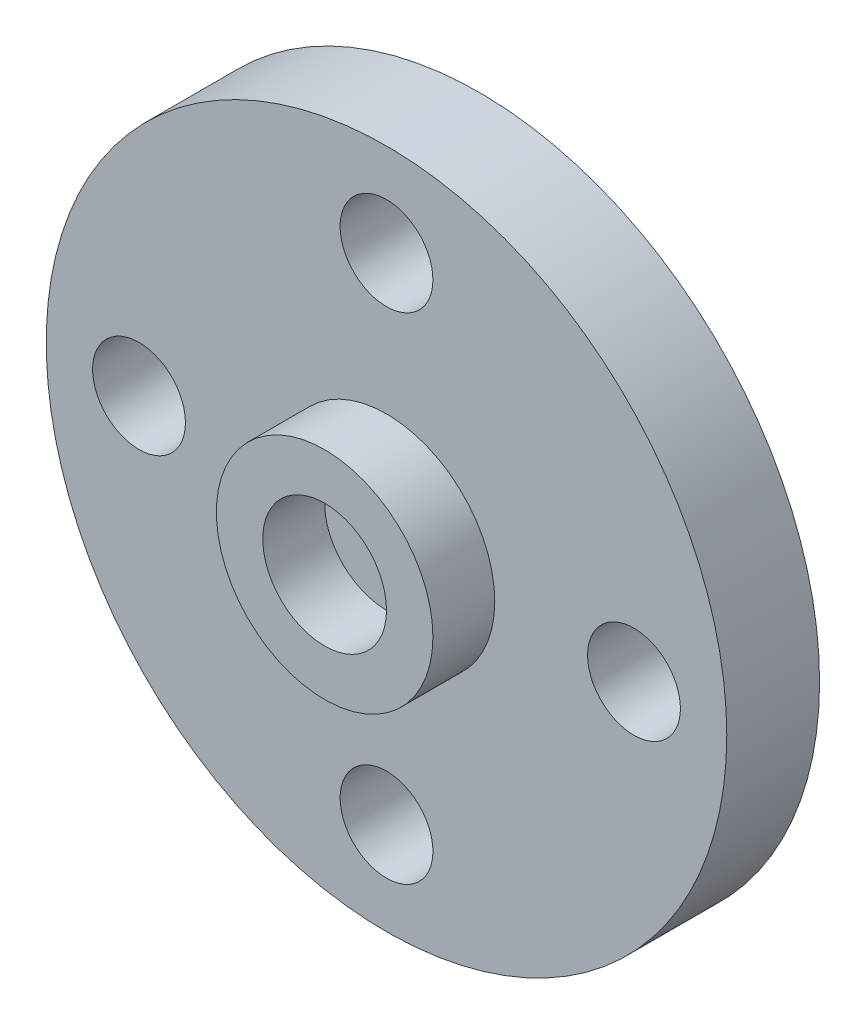
ISO-10303-21;
HEADER;
FILE_DESCRIPTION(('STEP AP214'),'2;1');
FILE_NAME('part.step','',(''),(''),'','','');
FILE_SCHEMA(('AUTOMOTIVE_DESIGN { 1 0 10303 214 1 1 1 1 }'));
ENDSEC;
DATA;
#1=APPLICATION_CONTEXT('core data for automotive mechanical design processes');
#2=APPLICATION_PROTOCOL_DEFINITION('international standard','automotive_design',2000,#1);
#3=PRODUCT_CONTEXT('',#1,'mechanical');
#4=PRODUCT('Part','Part','',(#3));
#5=PRODUCT_RELATED_PRODUCT_CATEGORY('part','',(#4));
#6=PRODUCT_DEFINITION_FORMATION('','',#4);
#7=PRODUCT_DEFINITION_CONTEXT('part definition',#1,'design');
#8=PRODUCT_DEFINITION('design','',#6,#7);
#9=PRODUCT_DEFINITION_SHAPE('','',#8);
#10=(LENGTH_UNIT() NAMED_UNIT(*) SI_UNIT(.MILLI.,.METRE.));
#11=(NAMED_UNIT(*) PLANE_ANGLE_UNIT() SI_UNIT($,.RADIAN.));
#12=(NAMED_UNIT(*) SI_UNIT($,.STERADIAN.) SOLID_ANGLE_UNIT());
#13=UNCERTAINTY_MEASURE_WITH_UNIT(LENGTH_MEASURE(1.E-05),#10,'distance_accuracy_value','');
#14=(GEOMETRIC_REPRESENTATION_CONTEXT(3) GLOBAL_UNCERTAINTY_ASSIGNED_CONTEXT((#13)) GLOBAL_UNIT_ASSIGNED_CONTEXT((#10,
#11,#12)) REPRESENTATION_CONTEXT('',''));
#15=CARTESIAN_POINT('',(0.,0.,0.));
#16=DIRECTION('',(0.,0.,1.));
#17=DIRECTION('',(1.,0.,0.));
#18=AXIS2_PLACEMENT_3D('',#15,#16,#17);
#19=CARTESIAN_POINT('',(0.,0.,3.));
#20=DIRECTION('',(0.,0.,-1.));
#21=DIRECTION('',(-1.,0.,0.));
#22=AXIS2_PLACEMENT_3D('',#19,#20,#21);
#23=CYLINDRICAL_SURFACE('',#22,11.);
#24=CARTESIAN_POINT('',(0.,0.,3.));
#25=DIRECTION('',(0.,0.,1.));
#26=DIRECTION('',(1.,0.,0.));
#27=AXIS2_PLACEMENT_3D('',#24,#25,#26);
#28=CIRCLE('',#27,11.);
#29=CARTESIAN_POINT('',(11.,0.,3.));
#30=VERTEX_POINT('',#29);
#31=EDGE_CURVE('E41',#30,#30,#28,.T.);
#32=ORIENTED_EDGE('',*,*,#31,.F.);
#33=EDGE_LOOP('',(#32));
#34=FACE_BOUND('',#33,.T.);
#35=CARTESIAN_POINT('',(0.,0.,0.));
#36=DIRECTION('',(0.,0.,1.));
#37=DIRECTION('',(1.,0.,0.));
#38=AXIS2_PLACEMENT_3D('',#35,#36,#37);
#39=CIRCLE('',#38,11.);
#40=CARTESIAN_POINT('',(11.,0.,0.));
#41=VERTEX_POINT('',#40);
#42=EDGE_CURVE('E45',#41,#41,#39,.T.);
#43=ORIENTED_EDGE('',*,*,#42,.T.);
#44=EDGE_LOOP('',(#43));
#45=FACE_BOUND('',#44,.T.);
#46=ADVANCED_FACE('F35',(#34,#45),#23,.T.);
#47=CARTESIAN_POINT('',(0.,0.,3.));
#48=DIRECTION('',(0.,0.,1.));
#49=DIRECTION('',(1.,0.,0.));
#50=AXIS2_PLACEMENT_3D('',#47,#48,#49);
#51=PLANE('',#50);
#52=CARTESIAN_POINT('',(0.,0.,3.));
#53=DIRECTION('',(0.,0.,1.));
#54=DIRECTION('',(1.,0.,0.));
#55=AXIS2_PLACEMENT_3D('',#52,#53,#54);
#56=CIRCLE('',#55,3.5);
#57=CARTESIAN_POINT('',(3.5,0.,3.));
#58=VERTEX_POINT('',#57);
#59=EDGE_CURVE('E76',#58,#58,#56,.T.);
#60=ORIENTED_EDGE('',*,*,#59,.F.);
#61=EDGE_LOOP('',(#60));
#62=FACE_BOUND('',#61,.T.);
#63=CARTESIAN_POINT('',(0.,8.,3.));
#64=DIRECTION('',(0.,0.,1.));
#65=DIRECTION('',(1.,0.,0.));
#66=AXIS2_PLACEMENT_3D('',#63,#64,#65);
#67=CIRCLE('',#66,1.5);
#68=CARTESIAN_POINT('',(1.5,8.,3.));
#69=VERTEX_POINT('',#68);
#70=EDGE_CURVE('E71',#69,#69,#67,.T.);
#71=ORIENTED_EDGE('',*,*,#70,.F.);
#72=EDGE_LOOP('',(#71));
#73=FACE_BOUND('',#72,.T.);
#74=CARTESIAN_POINT('',(-8.,0.,3.));
#75=DIRECTION('',(0.,0.,1.));
#76=DIRECTION('',(1.,0.,0.));
#77=AXIS2_PLACEMENT_3D('',#74,#75,#76);
#78=CIRCLE('',#77,1.5);
#79=CARTESIAN_POINT('',(-6.5,0.,3.));
#80=VERTEX_POINT('',#79);
#81=EDGE_CURVE('E68',#80,#80,#78,.T.);
#82=ORIENTED_EDGE('',*,*,#81,.F.);
#83=EDGE_LOOP('',(#82));
#84=FACE_BOUND('',#83,.T.);
#85=CARTESIAN_POINT('',(0.,-8.,3.));
#86=DIRECTION('',(0.,0.,1.));
#87=DIRECTION('',(-1.,0.,0.));
#88=AXIS2_PLACEMENT_3D('',#85,#86,#87);
#89=CIRCLE('',#88,1.5);
#90=CARTESIAN_POINT('',(-1.5,-8.,3.));
#91=VERTEX_POINT('',#90);
#92=EDGE_CURVE('E62',#91,#91,#89,.T.);
#93=ORIENTED_EDGE('',*,*,#92,.F.);
#94=EDGE_LOOP('',(#93));
#95=FACE_BOUND('',#94,.T.);
#96=CARTESIAN_POINT('',(8.,0.,3.));
#97=DIRECTION('',(0.,0.,1.));
#98=DIRECTION('',(-1.,0.,0.));
#99=AXIS2_PLACEMENT_3D('',#96,#97,#98);
#100=CIRCLE('',#99,1.5);
#101=CARTESIAN_POINT('',(6.5,0.,3.));
#102=VERTEX_POINT('',#101);
#103=EDGE_CURVE('E55',#102,#102,#100,.T.);
#104=ORIENTED_EDGE('',*,*,#103,.F.);
#105=EDGE_LOOP('',(#104));
#106=FACE_BOUND('',#105,.T.);
#107=ORIENTED_EDGE('',*,*,#31,.T.);
#108=EDGE_LOOP('',(#107));
#109=FACE_BOUND('',#108,.T.);
#110=ADVANCED_FACE('F104',(#62,#73,#84,#95,#106,#109),#51,.T.);
#111=CARTESIAN_POINT('',(0.,0.,0.));
#112=DIRECTION('',(0.,0.,1.));
#113=DIRECTION('',(1.,0.,0.));
#114=AXIS2_PLACEMENT_3D('',#111,#112,#113);
#115=PLANE('',#114);
#116=CARTESIAN_POINT('',(0.,8.,0.));
#117=DIRECTION('',(0.,0.,1.));
#118=DIRECTION('',(1.,0.,0.));
#119=AXIS2_PLACEMENT_3D('',#116,#117,#118);
#120=CIRCLE('',#119,1.5);
#121=CARTESIAN_POINT('',(1.5,8.,0.));
#122=VERTEX_POINT('',#121);
#123=EDGE_CURVE('E50',#122,#122,#120,.T.);
#124=ORIENTED_EDGE('',*,*,#123,.T.);
#125=EDGE_LOOP('',(#124));
#126=FACE_BOUND('',#125,.T.);
#127=CARTESIAN_POINT('',(-8.,0.,0.));
#128=DIRECTION('',(0.,0.,1.));
#129=DIRECTION('',(1.,0.,0.));
#130=AXIS2_PLACEMENT_3D('',#127,#128,#129);
#131=CIRCLE('',#130,1.5);
#132=CARTESIAN_POINT('',(-6.5,0.,0.));
#133=VERTEX_POINT('',#132);
#134=EDGE_CURVE('E65',#133,#133,#131,.T.);
#135=ORIENTED_EDGE('',*,*,#134,.T.);
#136=EDGE_LOOP('',(#135));
#137=FACE_BOUND('',#136,.T.);
#138=CARTESIAN_POINT('',(0.,-8.,0.));
#139=DIRECTION('',(0.,0.,1.));
#140=DIRECTION('',(-1.,0.,0.));
#141=AXIS2_PLACEMENT_3D('',#138,#139,#140);
#142=CIRCLE('',#141,1.5);
#143=CARTESIAN_POINT('',(-1.5,-8.,0.));
#144=VERTEX_POINT('',#143);
#145=EDGE_CURVE('E59',#144,#144,#142,.T.);
#146=ORIENTED_EDGE('',*,*,#145,.T.);
#147=EDGE_LOOP('',(#146));
#148=FACE_BOUND('',#147,.T.);
#149=CARTESIAN_POINT('',(8.,0.,0.));
#150=DIRECTION('',(0.,0.,1.));
#151=DIRECTION('',(-1.,0.,0.));
#152=AXIS2_PLACEMENT_3D('',#149,#150,#151);
#153=CIRCLE('',#152,1.5);
#154=CARTESIAN_POINT('',(6.5,0.,0.));
#155=VERTEX_POINT('',#154);
#156=EDGE_CURVE('E52',#155,#155,#153,.T.);
#157=ORIENTED_EDGE('',*,*,#156,.T.);
#158=EDGE_LOOP('',(#157));
#159=FACE_BOUND('',#158,.T.);
#160=ORIENTED_EDGE('',*,*,#42,.F.);
#161=EDGE_LOOP('',(#160));
#162=FACE_BOUND('',#161,.T.);
#163=ADVANCED_FACE('F109',(#126,#137,#148,#159,#162),#115,.F.);
#164=CARTESIAN_POINT('',(8.,0.,0.));
#165=DIRECTION('',(0.,0.,1.));
#166=DIRECTION('',(1.,0.,0.));
#167=AXIS2_PLACEMENT_3D('',#164,#165,#166);
#168=CYLINDRICAL_SURFACE('',#167,1.5);
#169=ORIENTED_EDGE('',*,*,#156,.F.);
#170=EDGE_LOOP('',(#169));
#171=FACE_BOUND('',#170,.T.);
#172=ORIENTED_EDGE('',*,*,#103,.T.);
#173=EDGE_LOOP('',(#172));
#174=FACE_BOUND('',#173,.T.);
#175=ADVANCED_FACE('F117',(#171,#174),#168,.F.);
#176=CARTESIAN_POINT('',(0.,-8.,0.));
#177=DIRECTION('',(0.,0.,1.));
#178=DIRECTION('',(1.,0.,0.));
#179=AXIS2_PLACEMENT_3D('',#176,#177,#178);
#180=CYLINDRICAL_SURFACE('',#179,1.5);
#181=ORIENTED_EDGE('',*,*,#145,.F.);
#182=EDGE_LOOP('',(#181));
#183=FACE_BOUND('',#182,.T.);
#184=ORIENTED_EDGE('',*,*,#92,.T.);
#185=EDGE_LOOP('',(#184));
#186=FACE_BOUND('',#185,.T.);
#187=ADVANCED_FACE('F122',(#183,#186),#180,.F.);
#188=CARTESIAN_POINT('',(-8.,0.,0.));
#189=DIRECTION('',(0.,0.,1.));
#190=DIRECTION('',(1.,0.,0.));
#191=AXIS2_PLACEMENT_3D('',#188,#189,#190);
#192=CYLINDRICAL_SURFACE('',#191,1.5);
#193=ORIENTED_EDGE('',*,*,#134,.F.);
#194=EDGE_LOOP('',(#193));
#195=FACE_BOUND('',#194,.T.);
#196=ORIENTED_EDGE('',*,*,#81,.T.);
#197=EDGE_LOOP('',(#196));
#198=FACE_BOUND('',#197,.T.);
#199=ADVANCED_FACE('F99',(#195,#198),#192,.F.);
#200=CARTESIAN_POINT('',(0.,8.,0.));
#201=DIRECTION('',(0.,0.,1.));
#202=DIRECTION('',(1.,0.,0.));
#203=AXIS2_PLACEMENT_3D('',#200,#201,#202);
#204=CYLINDRICAL_SURFACE('',#203,1.5);
#205=ORIENTED_EDGE('',*,*,#123,.F.);
#206=EDGE_LOOP('',(#205));
#207=FACE_BOUND('',#206,.T.);
#208=ORIENTED_EDGE('',*,*,#70,.T.);
#209=EDGE_LOOP('',(#208));
#210=FACE_BOUND('',#209,.T.);
#211=ADVANCED_FACE('F90',(#207,#210),#204,.F.);
#212=CARTESIAN_POINT('',(0.,0.,5.));
#213=DIRECTION('',(0.,0.,1.));
#214=DIRECTION('',(1.,0.,0.));
#215=AXIS2_PLACEMENT_3D('',#212,#213,#214);
#216=PLANE('',#215);
#217=CARTESIAN_POINT('',(0.,0.,5.));
#218=DIRECTION('',(0.,0.,1.));
#219=DIRECTION('',(1.,0.,0.));
#220=AXIS2_PLACEMENT_3D('',#217,#218,#219);
#221=CIRCLE('',#220,3.5);
#222=CARTESIAN_POINT('',(3.5,0.,5.));
#223=VERTEX_POINT('',#222);
#224=EDGE_CURVE('E56',#223,#223,#221,.T.);
#225=ORIENTED_EDGE('',*,*,#224,.T.);
#226=EDGE_LOOP('',(#225));
#227=FACE_BOUND('',#226,.T.);
#228=CARTESIAN_POINT('',(0.,0.,5.));
#229=DIRECTION('',(0.,0.,1.));
#230=DIRECTION('',(1.,0.,0.));
#231=AXIS2_PLACEMENT_3D('',#228,#229,#230);
#232=CIRCLE('',#231,2.);
#233=CARTESIAN_POINT('',(2.,0.,5.));
#234=VERTEX_POINT('',#233);
#235=EDGE_CURVE('E79',#234,#234,#232,.T.);
#236=ORIENTED_EDGE('',*,*,#235,.F.);
#237=EDGE_LOOP('',(#236));
#238=FACE_BOUND('',#237,.T.);
#239=ADVANCED_FACE('F87',(#227,#238),#216,.T.);
#240=CARTESIAN_POINT('',(0.,0.,5.));
#241=DIRECTION('',(0.,0.,-1.));
#242=DIRECTION('',(-1.,0.,0.));
#243=AXIS2_PLACEMENT_3D('',#240,#241,#242);
#244=CYLINDRICAL_SURFACE('',#243,3.5);
#245=ORIENTED_EDGE('',*,*,#224,.F.);
#246=EDGE_LOOP('',(#245));
#247=FACE_BOUND('',#246,.T.);
#248=ORIENTED_EDGE('',*,*,#59,.T.);
#249=EDGE_LOOP('',(#248));
#250=FACE_BOUND('',#249,.T.);
#251=ADVANCED_FACE('F89',(#247,#250),#244,.T.);
#252=CARTESIAN_POINT('',(0.,0.,5.));
#253=DIRECTION('',(0.,0.,-1.));
#254=DIRECTION('',(-1.,0.,0.));
#255=AXIS2_PLACEMENT_3D('',#252,#253,#254);
#256=CYLINDRICAL_SURFACE('',#255,2.);
#257=ORIENTED_EDGE('',*,*,#235,.T.);
#258=EDGE_LOOP('',(#257));
#259=FACE_BOUND('',#258,.T.);
#260=CARTESIAN_POINT('',(0.,0.,3.));
#261=DIRECTION('',(0.,0.,1.));
#262=DIRECTION('',(1.,0.,0.));
#263=AXIS2_PLACEMENT_3D('',#260,#261,#262);
#264=CIRCLE('',#263,2.);
#265=CARTESIAN_POINT('',(2.,0.,3.));
#266=VERTEX_POINT('',#265);
#267=EDGE_CURVE('E10',#266,#266,#264,.F.);
#268=ORIENTED_EDGE('',*,*,#267,.T.);
#269=EDGE_LOOP('',(#268));
#270=FACE_BOUND('',#269,.T.);
#271=ADVANCED_FACE('F85',(#259,#270),#256,.F.);
#272=ORIENTED_EDGE('',*,*,#267,.F.);
#273=EDGE_LOOP('',(#272));
#274=FACE_BOUND('',#273,.T.);
#275=ADVANCED_FACE('F112',(#274),#51,.T.);
#276=CLOSED_SHELL('',(#46,#110,#163,#175,#187,#199,#211,#239,#251,#271,#275));
#277=MANIFOLD_SOLID_BREP('B2',#276);
#278=ADVANCED_BREP_SHAPE_REPRESENTATION('',(#18,#277),#14);
#279=SHAPE_DEFINITION_REPRESENTATION(#9,#278);
ENDSEC;
END-ISO-10303-21;
